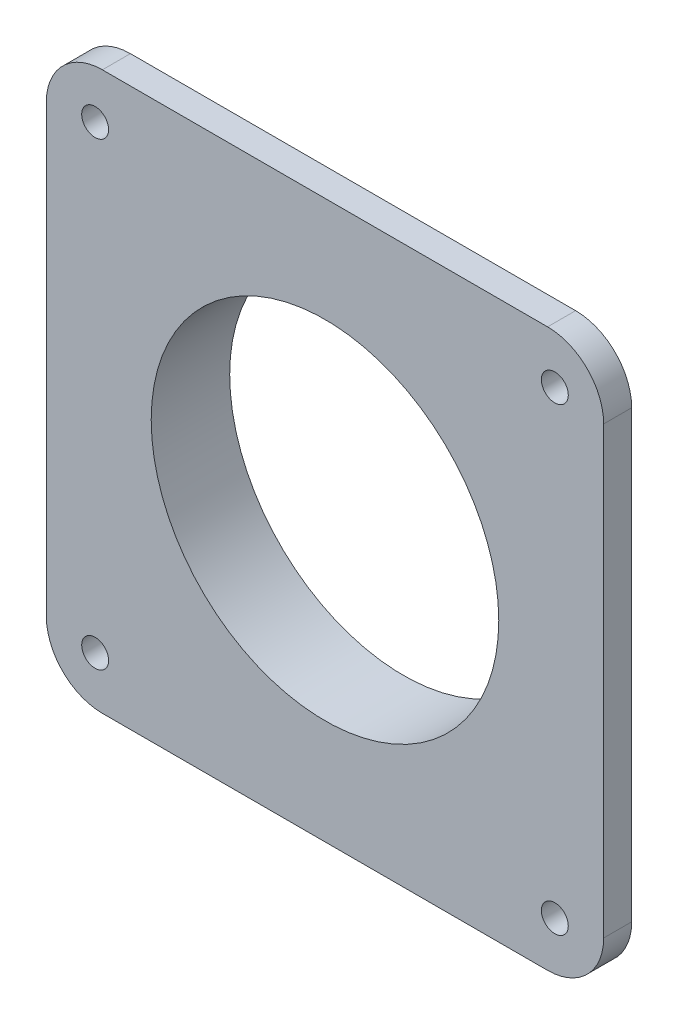
ISO-10303-21;
HEADER;
FILE_DESCRIPTION(('STEP AP214'),'2;1');
FILE_NAME('part.step','',(''),(''),'','','');
FILE_SCHEMA(('AUTOMOTIVE_DESIGN { 1 0 10303 214 1 1 1 1 }'));
ENDSEC;
DATA;
#1=APPLICATION_CONTEXT('core data for automotive mechanical design processes');
#2=APPLICATION_PROTOCOL_DEFINITION('international standard','automotive_design',2000,#1);
#3=PRODUCT_CONTEXT('',#1,'mechanical');
#4=PRODUCT('Part','Part','',(#3));
#5=PRODUCT_RELATED_PRODUCT_CATEGORY('part','',(#4));
#6=PRODUCT_DEFINITION_FORMATION('','',#4);
#7=PRODUCT_DEFINITION_CONTEXT('part definition',#1,'design');
#8=PRODUCT_DEFINITION('design','',#6,#7);
#9=PRODUCT_DEFINITION_SHAPE('','',#8);
#10=(LENGTH_UNIT() NAMED_UNIT(*) SI_UNIT(.MILLI.,.METRE.));
#11=(NAMED_UNIT(*) PLANE_ANGLE_UNIT() SI_UNIT($,.RADIAN.));
#12=(NAMED_UNIT(*) SI_UNIT($,.STERADIAN.) SOLID_ANGLE_UNIT());
#13=UNCERTAINTY_MEASURE_WITH_UNIT(LENGTH_MEASURE(1.E-05),#10,'distance_accuracy_value','');
#14=(GEOMETRIC_REPRESENTATION_CONTEXT(3) GLOBAL_UNCERTAINTY_ASSIGNED_CONTEXT((#13)) GLOBAL_UNIT_ASSIGNED_CONTEXT((#10,
#11,#12)) REPRESENTATION_CONTEXT('',''));
#15=CARTESIAN_POINT('',(0.,0.,0.));
#16=DIRECTION('',(0.,0.,1.));
#17=DIRECTION('',(1.,0.,0.));
#18=AXIS2_PLACEMENT_3D('',#15,#16,#17);
#19=CARTESIAN_POINT('',(0.,0.,5.));
#20=DIRECTION('',(0.,0.,-1.));
#21=DIRECTION('',(-1.,0.,0.));
#22=AXIS2_PLACEMENT_3D('',#19,#20,#21);
#23=PLANE('',#22);
#24=CARTESIAN_POINT('',(0.,0.,5.));
#25=DIRECTION('',(0.,0.,-1.));
#26=DIRECTION('',(-1.,0.,0.));
#27=AXIS2_PLACEMENT_3D('',#24,#25,#26);
#28=CIRCLE('',#27,45.1176601112219);
#29=CARTESIAN_POINT('',(-45.1176601112219,0.,5.));
#30=VERTEX_POINT('',#29);
#31=EDGE_CURVE('E11',#30,#30,#28,.F.);
#32=ORIENTED_EDGE('',*,*,#31,.T.);
#33=EDGE_LOOP('',(#32));
#34=FACE_BOUND('',#33,.T.);
#35=DIRECTION('',(-1.,0.,0.));
#36=VECTOR('',#35,1.);
#37=CARTESIAN_POINT('',(49.7075402963852,-49.7075402963859,5.));
#38=LINE('',#37,#36);
#39=CARTESIAN_POINT('',(39.7075402963852,-49.7075402963859,5.));
#40=VERTEX_POINT('',#39);
#41=CARTESIAN_POINT('',(-39.7075402963855,-49.7075402963859,5.));
#42=VERTEX_POINT('',#41);
#43=EDGE_CURVE('E107',#40,#42,#38,.T.);
#44=ORIENTED_EDGE('',*,*,#43,.T.);
#45=CARTESIAN_POINT('',(-39.7075402963855,-39.7075402963859,5.));
#46=DIRECTION('',(0.,0.,-1.));
#47=DIRECTION('',(-1.,0.,0.));
#48=AXIS2_PLACEMENT_3D('',#45,#46,#47);
#49=CIRCLE('',#48,10.);
#50=CARTESIAN_POINT('',(-49.7075402963856,-39.7075402963859,5.));
#51=VERTEX_POINT('',#50);
#52=EDGE_CURVE('E139',#42,#51,#49,.T.);
#53=ORIENTED_EDGE('',*,*,#52,.T.);
#54=DIRECTION('',(0.,1.,0.));
#55=VECTOR('',#54,1.);
#56=CARTESIAN_POINT('',(-49.7075402963856,-49.7075402963859,5.));
#57=LINE('',#56,#55);
#58=CARTESIAN_POINT('',(-49.7075402963856,39.7075402963855,5.));
#59=VERTEX_POINT('',#58);
#60=EDGE_CURVE('E124',#51,#59,#57,.T.);
#61=ORIENTED_EDGE('',*,*,#60,.T.);
#62=CARTESIAN_POINT('',(-39.7075402963856,39.7075402963855,5.));
#63=DIRECTION('',(0.,0.,-1.));
#64=DIRECTION('',(-1.,0.,0.));
#65=AXIS2_PLACEMENT_3D('',#62,#63,#64);
#66=CIRCLE('',#65,10.);
#67=CARTESIAN_POINT('',(-39.7075402963856,49.7075402963856,5.));
#68=VERTEX_POINT('',#67);
#69=EDGE_CURVE('E137',#59,#68,#66,.T.);
#70=ORIENTED_EDGE('',*,*,#69,.T.);
#71=DIRECTION('',(1.,0.,0.));
#72=VECTOR('',#71,1.);
#73=CARTESIAN_POINT('',(-49.7075402963856,49.7075402963856,5.));
#74=LINE('',#73,#72);
#75=CARTESIAN_POINT('',(39.7075402963852,49.7075402963856,5.));
#76=VERTEX_POINT('',#75);
#77=EDGE_CURVE('E170',#68,#76,#74,.T.);
#78=ORIENTED_EDGE('',*,*,#77,.T.);
#79=CARTESIAN_POINT('',(39.7075402963852,39.7075402963856,5.));
#80=DIRECTION('',(0.,0.,-1.));
#81=DIRECTION('',(-1.,0.,0.));
#82=AXIS2_PLACEMENT_3D('',#79,#80,#81);
#83=CIRCLE('',#82,10.);
#84=CARTESIAN_POINT('',(49.7075402963852,39.7075402963855,5.));
#85=VERTEX_POINT('',#84);
#86=EDGE_CURVE('E114',#76,#85,#83,.T.);
#87=ORIENTED_EDGE('',*,*,#86,.T.);
#88=DIRECTION('',(0.,-1.,0.));
#89=VECTOR('',#88,1.);
#90=CARTESIAN_POINT('',(49.7075402963852,-49.7075402963859,5.));
#91=LINE('',#90,#89);
#92=CARTESIAN_POINT('',(49.7075402963852,-39.7075402963859,5.));
#93=VERTEX_POINT('',#92);
#94=EDGE_CURVE('E109',#85,#93,#91,.T.);
#95=ORIENTED_EDGE('',*,*,#94,.T.);
#96=CARTESIAN_POINT('',(39.7075402963852,-39.7075402963859,5.));
#97=DIRECTION('',(0.,0.,-1.));
#98=DIRECTION('',(-1.,0.,0.));
#99=AXIS2_PLACEMENT_3D('',#96,#97,#98);
#100=CIRCLE('',#99,10.);
#101=EDGE_CURVE('E104',#93,#40,#100,.T.);
#102=ORIENTED_EDGE('',*,*,#101,.T.);
#103=EDGE_LOOP('',(#44,#53,#61,#70,#78,#87,#95,#102));
#104=FACE_BOUND('',#103,.T.);
#105=CARTESIAN_POINT('',(-41.,41.,5.));
#106=DIRECTION('',(0.,0.,-1.));
#107=DIRECTION('',(-1.,0.,0.));
#108=AXIS2_PLACEMENT_3D('',#105,#106,#107);
#109=CIRCLE('',#108,2.4);
#110=CARTESIAN_POINT('',(-43.4,41.,5.));
#111=VERTEX_POINT('',#110);
#112=EDGE_CURVE('E172',#111,#111,#109,.T.);
#113=ORIENTED_EDGE('',*,*,#112,.F.);
#114=EDGE_LOOP('',(#113));
#115=FACE_BOUND('',#114,.T.);
#116=CARTESIAN_POINT('',(41.,41.,5.));
#117=DIRECTION('',(0.,0.,-1.));
#118=DIRECTION('',(-1.,0.,0.));
#119=AXIS2_PLACEMENT_3D('',#116,#117,#118);
#120=CIRCLE('',#119,2.4);
#121=CARTESIAN_POINT('',(38.6,41.,5.));
#122=VERTEX_POINT('',#121);
#123=EDGE_CURVE('E176',#122,#122,#120,.T.);
#124=ORIENTED_EDGE('',*,*,#123,.F.);
#125=EDGE_LOOP('',(#124));
#126=FACE_BOUND('',#125,.T.);
#127=CARTESIAN_POINT('',(41.,-41.,5.));
#128=DIRECTION('',(0.,0.,-1.));
#129=DIRECTION('',(-1.,0.,0.));
#130=AXIS2_PLACEMENT_3D('',#127,#128,#129);
#131=CIRCLE('',#130,2.4);
#132=CARTESIAN_POINT('',(38.6,-41.,5.));
#133=VERTEX_POINT('',#132);
#134=EDGE_CURVE('E404',#133,#133,#131,.T.);
#135=ORIENTED_EDGE('',*,*,#134,.F.);
#136=EDGE_LOOP('',(#135));
#137=FACE_BOUND('',#136,.T.);
#138=CARTESIAN_POINT('',(-41.,-41.,5.));
#139=DIRECTION('',(0.,0.,-1.));
#140=DIRECTION('',(-1.,0.,0.));
#141=AXIS2_PLACEMENT_3D('',#138,#139,#140);
#142=CIRCLE('',#141,2.4);
#143=CARTESIAN_POINT('',(-43.4,-41.,5.));
#144=VERTEX_POINT('',#143);
#145=EDGE_CURVE('E400',#144,#144,#142,.T.);
#146=ORIENTED_EDGE('',*,*,#145,.F.);
#147=EDGE_LOOP('',(#146));
#148=FACE_BOUND('',#147,.T.);
#149=ADVANCED_FACE('F37',(#34,#104,#115,#126,#137,#148),#23,.T.);
#150=CARTESIAN_POINT('',(-49.7075402963856,-49.7075402963859,10.));
#151=DIRECTION('',(1.,0.,0.));
#152=DIRECTION('',(0.,0.,-1.));
#153=AXIS2_PLACEMENT_3D('',#150,#151,#152);
#154=PLANE('',#153);
#155=ORIENTED_EDGE('',*,*,#60,.F.);
#156=DIRECTION('',(0.,0.,-1.));
#157=VECTOR('',#156,1.);
#158=CARTESIAN_POINT('',(-49.7075402963856,-39.7075402963859,10.));
#159=LINE('',#158,#157);
#160=CARTESIAN_POINT('',(-49.7075402963856,-39.7075402963859,10.));
#161=VERTEX_POINT('',#160);
#162=EDGE_CURVE('E144',#51,#161,#159,.F.);
#163=ORIENTED_EDGE('',*,*,#162,.T.);
#164=DIRECTION('',(0.,-1.,0.));
#165=VECTOR('',#164,1.);
#166=CARTESIAN_POINT('',(-49.7075402963856,-49.7075402963859,10.));
#167=LINE('',#166,#165);
#168=CARTESIAN_POINT('',(-49.7075402963856,39.7075402963855,10.));
#169=VERTEX_POINT('',#168);
#170=EDGE_CURVE('E196',#169,#161,#167,.T.);
#171=ORIENTED_EDGE('',*,*,#170,.F.);
#172=DIRECTION('',(0.,0.,-1.));
#173=VECTOR('',#172,1.);
#174=CARTESIAN_POINT('',(-49.7075402963856,39.7075402963855,10.));
#175=LINE('',#174,#173);
#176=EDGE_CURVE('E141',#169,#59,#175,.T.);
#177=ORIENTED_EDGE('',*,*,#176,.T.);
#178=EDGE_LOOP('',(#155,#163,#171,#177));
#179=FACE_BOUND('',#178,.T.);
#180=ADVANCED_FACE('F204',(#179),#154,.F.);
#181=CARTESIAN_POINT('',(49.7075402963852,-49.7075402963859,10.));
#182=DIRECTION('',(0.,1.,0.));
#183=DIRECTION('',(0.,0.,1.));
#184=AXIS2_PLACEMENT_3D('',#181,#182,#183);
#185=PLANE('',#184);
#186=DIRECTION('',(1.,0.,0.));
#187=VECTOR('',#186,1.);
#188=CARTESIAN_POINT('',(49.7075402963852,-49.7075402963859,10.));
#189=LINE('',#188,#187);
#190=CARTESIAN_POINT('',(-39.7075402963855,-49.7075402963859,10.));
#191=VERTEX_POINT('',#190);
#192=CARTESIAN_POINT('',(39.7075402963852,-49.7075402963859,10.));
#193=VERTEX_POINT('',#192);
#194=EDGE_CURVE('E165',#191,#193,#189,.T.);
#195=ORIENTED_EDGE('',*,*,#194,.F.);
#196=DIRECTION('',(0.,0.,-1.));
#197=VECTOR('',#196,1.);
#198=CARTESIAN_POINT('',(-39.7075402963855,-49.7075402963859,10.));
#199=LINE('',#198,#197);
#200=EDGE_CURVE('E115',#191,#42,#199,.T.);
#201=ORIENTED_EDGE('',*,*,#200,.T.);
#202=ORIENTED_EDGE('',*,*,#43,.F.);
#203=DIRECTION('',(0.,0.,-1.));
#204=VECTOR('',#203,1.);
#205=CARTESIAN_POINT('',(39.7075402963852,-49.7075402963859,10.));
#206=LINE('',#205,#204);
#207=EDGE_CURVE('E121',#40,#193,#206,.F.);
#208=ORIENTED_EDGE('',*,*,#207,.T.);
#209=EDGE_LOOP('',(#195,#201,#202,#208));
#210=FACE_BOUND('',#209,.T.);
#211=ADVANCED_FACE('F120',(#210),#185,.F.);
#212=CARTESIAN_POINT('',(49.7075402963852,-49.7075402963859,10.));
#213=DIRECTION('',(-1.,0.,0.));
#214=DIRECTION('',(0.,0.,1.));
#215=AXIS2_PLACEMENT_3D('',#212,#213,#214);
#216=PLANE('',#215);
#217=ORIENTED_EDGE('',*,*,#94,.F.);
#218=DIRECTION('',(0.,0.,-1.));
#219=VECTOR('',#218,1.);
#220=CARTESIAN_POINT('',(49.7075402963852,39.7075402963855,10.));
#221=LINE('',#220,#219);
#222=CARTESIAN_POINT('',(49.7075402963852,39.7075402963855,10.));
#223=VERTEX_POINT('',#222);
#224=EDGE_CURVE('E45',#85,#223,#221,.F.);
#225=ORIENTED_EDGE('',*,*,#224,.T.);
#226=DIRECTION('',(0.,1.,0.));
#227=VECTOR('',#226,1.);
#228=CARTESIAN_POINT('',(49.7075402963852,-49.7075402963859,10.));
#229=LINE('',#228,#227);
#230=CARTESIAN_POINT('',(49.7075402963852,-39.7075402963859,10.));
#231=VERTEX_POINT('',#230);
#232=EDGE_CURVE('E132',#231,#223,#229,.T.);
#233=ORIENTED_EDGE('',*,*,#232,.F.);
#234=DIRECTION('',(0.,0.,-1.));
#235=VECTOR('',#234,1.);
#236=CARTESIAN_POINT('',(49.7075402963852,-39.7075402963859,10.));
#237=LINE('',#236,#235);
#238=EDGE_CURVE('E156',#231,#93,#237,.T.);
#239=ORIENTED_EDGE('',*,*,#238,.T.);
#240=EDGE_LOOP('',(#217,#225,#233,#239));
#241=FACE_BOUND('',#240,.T.);
#242=ADVANCED_FACE('F160',(#241),#216,.F.);
#243=CARTESIAN_POINT('',(-49.7075402963856,49.7075402963856,10.));
#244=DIRECTION('',(0.,-1.,0.));
#245=DIRECTION('',(0.,0.,-1.));
#246=AXIS2_PLACEMENT_3D('',#243,#244,#245);
#247=PLANE('',#246);
#248=ORIENTED_EDGE('',*,*,#77,.F.);
#249=DIRECTION('',(0.,0.,-1.));
#250=VECTOR('',#249,1.);
#251=CARTESIAN_POINT('',(-39.7075402963856,49.7075402963856,10.));
#252=LINE('',#251,#250);
#253=CARTESIAN_POINT('',(-39.7075402963856,49.7075402963856,10.));
#254=VERTEX_POINT('',#253);
#255=EDGE_CURVE('E52',#68,#254,#252,.F.);
#256=ORIENTED_EDGE('',*,*,#255,.T.);
#257=DIRECTION('',(-1.,0.,0.));
#258=VECTOR('',#257,1.);
#259=CARTESIAN_POINT('',(-49.7075402963856,49.7075402963856,10.));
#260=LINE('',#259,#258);
#261=CARTESIAN_POINT('',(39.7075402963852,49.7075402963856,10.));
#262=VERTEX_POINT('',#261);
#263=EDGE_CURVE('E129',#262,#254,#260,.T.);
#264=ORIENTED_EDGE('',*,*,#263,.F.);
#265=DIRECTION('',(0.,0.,-1.));
#266=VECTOR('',#265,1.);
#267=CARTESIAN_POINT('',(39.7075402963852,49.7075402963856,10.));
#268=LINE('',#267,#266);
#269=EDGE_CURVE('E152',#262,#76,#268,.T.);
#270=ORIENTED_EDGE('',*,*,#269,.T.);
#271=EDGE_LOOP('',(#248,#256,#264,#270));
#272=FACE_BOUND('',#271,.T.);
#273=ADVANCED_FACE('F169',(#272),#247,.F.);
#274=CARTESIAN_POINT('',(-41.,41.,10.));
#275=DIRECTION('',(0.,0.,-1.));
#276=DIRECTION('',(-1.,0.,0.));
#277=AXIS2_PLACEMENT_3D('',#274,#275,#276);
#278=CYLINDRICAL_SURFACE('',#277,2.4);
#279=CARTESIAN_POINT('',(-41.,41.,10.));
#280=DIRECTION('',(0.,0.,1.));
#281=DIRECTION('',(1.,0.,0.));
#282=AXIS2_PLACEMENT_3D('',#279,#280,#281);
#283=CIRCLE('',#282,2.4);
#284=CARTESIAN_POINT('',(-38.6,41.,10.));
#285=VERTEX_POINT('',#284);
#286=EDGE_CURVE('E193',#285,#285,#283,.T.);
#287=ORIENTED_EDGE('',*,*,#286,.T.);
#288=EDGE_LOOP('',(#287));
#289=FACE_BOUND('',#288,.T.);
#290=ORIENTED_EDGE('',*,*,#112,.T.);
#291=EDGE_LOOP('',(#290));
#292=FACE_BOUND('',#291,.T.);
#293=ADVANCED_FACE('F243',(#289,#292),#278,.F.);
#294=CARTESIAN_POINT('',(41.,41.,10.));
#295=DIRECTION('',(0.,0.,-1.));
#296=DIRECTION('',(-1.,0.,0.));
#297=AXIS2_PLACEMENT_3D('',#294,#295,#296);
#298=CYLINDRICAL_SURFACE('',#297,2.4);
#299=CARTESIAN_POINT('',(41.,41.,10.));
#300=DIRECTION('',(0.,0.,1.));
#301=DIRECTION('',(1.,0.,0.));
#302=AXIS2_PLACEMENT_3D('',#299,#300,#301);
#303=CIRCLE('',#302,2.4);
#304=CARTESIAN_POINT('',(43.4,41.,10.));
#305=VERTEX_POINT('',#304);
#306=EDGE_CURVE('E190',#305,#305,#303,.T.);
#307=ORIENTED_EDGE('',*,*,#306,.T.);
#308=EDGE_LOOP('',(#307));
#309=FACE_BOUND('',#308,.T.);
#310=ORIENTED_EDGE('',*,*,#123,.T.);
#311=EDGE_LOOP('',(#310));
#312=FACE_BOUND('',#311,.T.);
#313=ADVANCED_FACE('F239',(#309,#312),#298,.F.);
#314=CARTESIAN_POINT('',(41.,-41.,10.));
#315=DIRECTION('',(0.,0.,-1.));
#316=DIRECTION('',(-1.,0.,0.));
#317=AXIS2_PLACEMENT_3D('',#314,#315,#316);
#318=CYLINDRICAL_SURFACE('',#317,2.4);
#319=CARTESIAN_POINT('',(41.,-41.,10.));
#320=DIRECTION('',(0.,0.,1.));
#321=DIRECTION('',(1.,0.,0.));
#322=AXIS2_PLACEMENT_3D('',#319,#320,#321);
#323=CIRCLE('',#322,2.4);
#324=CARTESIAN_POINT('',(43.4,-41.,10.));
#325=VERTEX_POINT('',#324);
#326=EDGE_CURVE('E187',#325,#325,#323,.T.);
#327=ORIENTED_EDGE('',*,*,#326,.T.);
#328=EDGE_LOOP('',(#327));
#329=FACE_BOUND('',#328,.T.);
#330=ORIENTED_EDGE('',*,*,#134,.T.);
#331=EDGE_LOOP('',(#330));
#332=FACE_BOUND('',#331,.T.);
#333=ADVANCED_FACE('F235',(#329,#332),#318,.F.);
#334=CARTESIAN_POINT('',(-41.,-41.,10.));
#335=DIRECTION('',(0.,0.,-1.));
#336=DIRECTION('',(-1.,0.,0.));
#337=AXIS2_PLACEMENT_3D('',#334,#335,#336);
#338=CYLINDRICAL_SURFACE('',#337,2.4);
#339=CARTESIAN_POINT('',(-41.,-41.,10.));
#340=DIRECTION('',(0.,0.,1.));
#341=DIRECTION('',(1.,0.,0.));
#342=AXIS2_PLACEMENT_3D('',#339,#340,#341);
#343=CIRCLE('',#342,2.4);
#344=CARTESIAN_POINT('',(-38.6,-41.,10.));
#345=VERTEX_POINT('',#344);
#346=EDGE_CURVE('E184',#345,#345,#343,.T.);
#347=ORIENTED_EDGE('',*,*,#346,.T.);
#348=EDGE_LOOP('',(#347));
#349=FACE_BOUND('',#348,.T.);
#350=ORIENTED_EDGE('',*,*,#145,.T.);
#351=EDGE_LOOP('',(#350));
#352=FACE_BOUND('',#351,.T.);
#353=ADVANCED_FACE('F231',(#349,#352),#338,.F.);
#354=CARTESIAN_POINT('',(0.,0.,10.));
#355=DIRECTION('',(0.,0.,-1.));
#356=DIRECTION('',(-1.,0.,0.));
#357=AXIS2_PLACEMENT_3D('',#354,#355,#356);
#358=CYLINDRICAL_SURFACE('',#357,31.);
#359=CARTESIAN_POINT('',(0.,0.,10.));
#360=DIRECTION('',(0.,0.,1.));
#361=DIRECTION('',(1.,0.,0.));
#362=AXIS2_PLACEMENT_3D('',#359,#360,#361);
#363=CIRCLE('',#362,31.);
#364=CARTESIAN_POINT('',(31.,0.,10.));
#365=VERTEX_POINT('',#364);
#366=EDGE_CURVE('E181',#365,#365,#363,.T.);
#367=ORIENTED_EDGE('',*,*,#366,.T.);
#368=EDGE_LOOP('',(#367));
#369=FACE_BOUND('',#368,.T.);
#370=CARTESIAN_POINT('',(0.,0.,-4.));
#371=DIRECTION('',(0.,0.,-1.));
#372=DIRECTION('',(-1.,0.,0.));
#373=AXIS2_PLACEMENT_3D('',#370,#371,#372);
#374=CIRCLE('',#373,31.);
#375=CARTESIAN_POINT('',(-31.,0.,-4.));
#376=VERTEX_POINT('',#375);
#377=EDGE_CURVE('E401',#376,#376,#374,.T.);
#378=ORIENTED_EDGE('',*,*,#377,.T.);
#379=EDGE_LOOP('',(#378));
#380=FACE_BOUND('',#379,.T.);
#381=ADVANCED_FACE('F228',(#369,#380),#358,.F.);
#382=CARTESIAN_POINT('',(0.,0.,10.));
#383=DIRECTION('',(0.,0.,-1.));
#384=DIRECTION('',(-1.,0.,0.));
#385=AXIS2_PLACEMENT_3D('',#382,#383,#384);
#386=PLANE('',#385);
#387=ORIENTED_EDGE('',*,*,#170,.T.);
#388=CARTESIAN_POINT('',(-39.7075402963855,-39.7075402963859,10.));
#389=DIRECTION('',(0.,0.,-1.));
#390=DIRECTION('',(-1.,0.,0.));
#391=AXIS2_PLACEMENT_3D('',#388,#389,#390);
#392=CIRCLE('',#391,10.);
#393=EDGE_CURVE('E150',#161,#191,#392,.F.);
#394=ORIENTED_EDGE('',*,*,#393,.T.);
#395=ORIENTED_EDGE('',*,*,#194,.T.);
#396=CARTESIAN_POINT('',(39.7075402963852,-39.7075402963859,10.));
#397=DIRECTION('',(0.,0.,-1.));
#398=DIRECTION('',(-1.,0.,0.));
#399=AXIS2_PLACEMENT_3D('',#396,#397,#398);
#400=CIRCLE('',#399,10.);
#401=EDGE_CURVE('E128',#193,#231,#400,.F.);
#402=ORIENTED_EDGE('',*,*,#401,.T.);
#403=ORIENTED_EDGE('',*,*,#232,.T.);
#404=CARTESIAN_POINT('',(39.7075402963852,39.7075402963856,10.));
#405=DIRECTION('',(0.,0.,-1.));
#406=DIRECTION('',(-1.,0.,0.));
#407=AXIS2_PLACEMENT_3D('',#404,#405,#406);
#408=CIRCLE('',#407,10.);
#409=EDGE_CURVE('E59',#223,#262,#408,.F.);
#410=ORIENTED_EDGE('',*,*,#409,.T.);
#411=ORIENTED_EDGE('',*,*,#263,.T.);
#412=CARTESIAN_POINT('',(-39.7075402963856,39.7075402963855,10.));
#413=DIRECTION('',(0.,0.,-1.));
#414=DIRECTION('',(-1.,0.,0.));
#415=AXIS2_PLACEMENT_3D('',#412,#413,#414);
#416=CIRCLE('',#415,10.);
#417=EDGE_CURVE('E148',#254,#169,#416,.F.);
#418=ORIENTED_EDGE('',*,*,#417,.T.);
#419=EDGE_LOOP('',(#387,#394,#395,#402,#403,#410,#411,#418));
#420=FACE_BOUND('',#419,.T.);
#421=ORIENTED_EDGE('',*,*,#286,.F.);
#422=EDGE_LOOP('',(#421));
#423=FACE_BOUND('',#422,.T.);
#424=ORIENTED_EDGE('',*,*,#306,.F.);
#425=EDGE_LOOP('',(#424));
#426=FACE_BOUND('',#425,.T.);
#427=ORIENTED_EDGE('',*,*,#326,.F.);
#428=EDGE_LOOP('',(#427));
#429=FACE_BOUND('',#428,.T.);
#430=ORIENTED_EDGE('',*,*,#346,.F.);
#431=EDGE_LOOP('',(#430));
#432=FACE_BOUND('',#431,.T.);
#433=ORIENTED_EDGE('',*,*,#366,.F.);
#434=EDGE_LOOP('',(#433));
#435=FACE_BOUND('',#434,.T.);
#436=ADVANCED_FACE('F163',(#420,#423,#426,#429,#432,#435),#386,.F.);
#437=CARTESIAN_POINT('',(-39.7075402963855,-39.7075402963859,10.));
#438=DIRECTION('',(0.,0.,-1.));
#439=DIRECTION('',(-1.,0.,0.));
#440=AXIS2_PLACEMENT_3D('',#437,#438,#439);
#441=CYLINDRICAL_SURFACE('',#440,10.);
#442=ORIENTED_EDGE('',*,*,#393,.F.);
#443=ORIENTED_EDGE('',*,*,#162,.F.);
#444=ORIENTED_EDGE('',*,*,#52,.F.);
#445=ORIENTED_EDGE('',*,*,#200,.F.);
#446=EDGE_LOOP('',(#442,#443,#444,#445));
#447=FACE_BOUND('',#446,.T.);
#448=ADVANCED_FACE('F200',(#447),#441,.T.);
#449=CARTESIAN_POINT('',(-39.7075402963856,39.7075402963855,10.));
#450=DIRECTION('',(0.,0.,-1.));
#451=DIRECTION('',(-1.,0.,0.));
#452=AXIS2_PLACEMENT_3D('',#449,#450,#451);
#453=CYLINDRICAL_SURFACE('',#452,10.);
#454=ORIENTED_EDGE('',*,*,#417,.F.);
#455=ORIENTED_EDGE('',*,*,#255,.F.);
#456=ORIENTED_EDGE('',*,*,#69,.F.);
#457=ORIENTED_EDGE('',*,*,#176,.F.);
#458=EDGE_LOOP('',(#454,#455,#456,#457));
#459=FACE_BOUND('',#458,.T.);
#460=ADVANCED_FACE('F209',(#459),#453,.T.);
#461=CARTESIAN_POINT('',(39.7075402963852,39.7075402963856,10.));
#462=DIRECTION('',(0.,0.,-1.));
#463=DIRECTION('',(-1.,0.,0.));
#464=AXIS2_PLACEMENT_3D('',#461,#462,#463);
#465=CYLINDRICAL_SURFACE('',#464,10.);
#466=ORIENTED_EDGE('',*,*,#409,.F.);
#467=ORIENTED_EDGE('',*,*,#224,.F.);
#468=ORIENTED_EDGE('',*,*,#86,.F.);
#469=ORIENTED_EDGE('',*,*,#269,.F.);
#470=EDGE_LOOP('',(#466,#467,#468,#469));
#471=FACE_BOUND('',#470,.T.);
#472=ADVANCED_FACE('F167',(#471),#465,.T.);
#473=CARTESIAN_POINT('',(39.7075402963852,-39.7075402963859,10.));
#474=DIRECTION('',(0.,0.,-1.));
#475=DIRECTION('',(-1.,0.,0.));
#476=AXIS2_PLACEMENT_3D('',#473,#474,#475);
#477=CYLINDRICAL_SURFACE('',#476,10.);
#478=ORIENTED_EDGE('',*,*,#401,.F.);
#479=ORIENTED_EDGE('',*,*,#207,.F.);
#480=ORIENTED_EDGE('',*,*,#101,.F.);
#481=ORIENTED_EDGE('',*,*,#238,.F.);
#482=EDGE_LOOP('',(#478,#479,#480,#481));
#483=FACE_BOUND('',#482,.T.);
#484=ADVANCED_FACE('F127',(#483),#477,.T.);
#485=CARTESIAN_POINT('',(0.,0.,-4.));
#486=DIRECTION('',(0.,0.,-1.));
#487=DIRECTION('',(-1.,0.,0.));
#488=AXIS2_PLACEMENT_3D('',#485,#486,#487);
#489=PLANE('',#488);
#490=CARTESIAN_POINT('',(0.,0.,-4.));
#491=DIRECTION('',(0.,0.,-1.));
#492=DIRECTION('',(-1.,0.,0.));
#493=AXIS2_PLACEMENT_3D('',#490,#491,#492);
#494=CIRCLE('',#493,35.1677857401557);
#495=CARTESIAN_POINT('',(-35.1677857401557,0.,-4.));
#496=VERTEX_POINT('',#495);
#497=EDGE_CURVE('E399',#496,#496,#494,.T.);
#498=ORIENTED_EDGE('',*,*,#497,.T.);
#499=EDGE_LOOP('',(#498));
#500=FACE_BOUND('',#499,.T.);
#501=ORIENTED_EDGE('',*,*,#377,.F.);
#502=EDGE_LOOP('',(#501));
#503=FACE_BOUND('',#502,.T.);
#504=ADVANCED_FACE('F227',(#500,#503),#489,.T.);
#505=CARTESIAN_POINT('',(0.,0.,-5.));
#506=DIRECTION('',(0.,0.,-1.));
#507=DIRECTION('',(-1.,0.,0.));
#508=AXIS2_PLACEMENT_3D('',#505,#506,#507);
#509=TOROIDAL_SURFACE('',#508,45.1176601112219,10.);
#510=ORIENTED_EDGE('',*,*,#31,.F.);
#511=EDGE_LOOP('',(#510));
#512=FACE_BOUND('',#511,.T.);
#513=ORIENTED_EDGE('',*,*,#497,.F.);
#514=EDGE_LOOP('',(#513));
#515=FACE_BOUND('',#514,.T.);
#516=ADVANCED_FACE('F39',(#512,#515),#509,.F.);
#517=CLOSED_SHELL('',(#149,#180,#211,#242,#273,#293,#313,#333,#353,#381,#436,#448,#460,#472,
#484,#504,#516));
#518=MANIFOLD_SOLID_BREP('B2',#517);
#519=ADVANCED_BREP_SHAPE_REPRESENTATION('',(#18,#518),#14);
#520=SHAPE_DEFINITION_REPRESENTATION(#9,#519);
ENDSEC;
END-ISO-10303-21;
